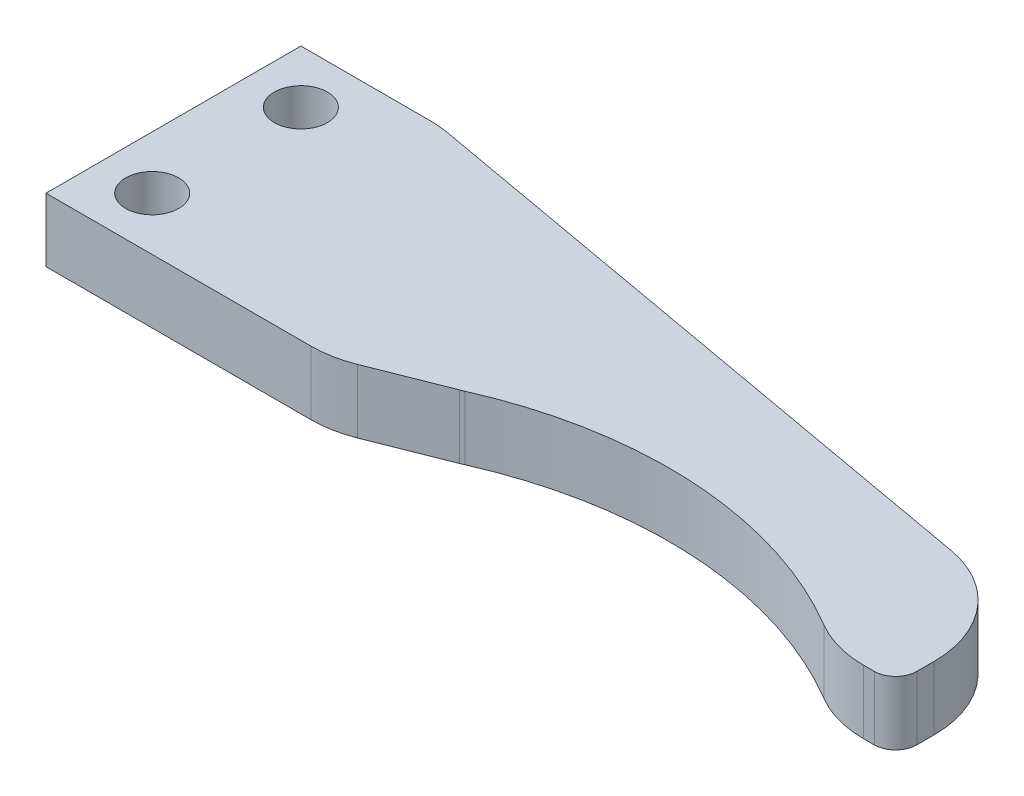
ISO-10303-21;
HEADER;
FILE_DESCRIPTION(('STEP AP214'),'2;1');
FILE_NAME('part.step','',(''),(''),'','','');
FILE_SCHEMA(('AUTOMOTIVE_DESIGN { 1 0 10303 214 1 1 1 1 }'));
ENDSEC;
DATA;
#1=APPLICATION_CONTEXT('core data for automotive mechanical design processes');
#2=APPLICATION_PROTOCOL_DEFINITION('international standard','automotive_design',2000,#1);
#3=PRODUCT_CONTEXT('',#1,'mechanical');
#4=PRODUCT('Part','Part','',(#3));
#5=PRODUCT_RELATED_PRODUCT_CATEGORY('part','',(#4));
#6=PRODUCT_DEFINITION_FORMATION('','',#4);
#7=PRODUCT_DEFINITION_CONTEXT('part definition',#1,'design');
#8=PRODUCT_DEFINITION('design','',#6,#7);
#9=PRODUCT_DEFINITION_SHAPE('','',#8);
#10=(LENGTH_UNIT() NAMED_UNIT(*) SI_UNIT(.MILLI.,.METRE.));
#11=(NAMED_UNIT(*) PLANE_ANGLE_UNIT() SI_UNIT($,.RADIAN.));
#12=(NAMED_UNIT(*) SI_UNIT($,.STERADIAN.) SOLID_ANGLE_UNIT());
#13=UNCERTAINTY_MEASURE_WITH_UNIT(LENGTH_MEASURE(1.E-05),#10,'distance_accuracy_value','');
#14=(GEOMETRIC_REPRESENTATION_CONTEXT(3) GLOBAL_UNCERTAINTY_ASSIGNED_CONTEXT((#13)) GLOBAL_UNIT_ASSIGNED_CONTEXT((#10,
#11,#12)) REPRESENTATION_CONTEXT('',''));
#15=CARTESIAN_POINT('',(0.,0.,0.));
#16=DIRECTION('',(0.,0.,1.));
#17=DIRECTION('',(1.,0.,0.));
#18=AXIS2_PLACEMENT_3D('',#15,#16,#17);
#19=CARTESIAN_POINT('',(20.,3.,6.));
#20=DIRECTION('',(0.,0.,-1.));
#21=DIRECTION('',(-1.,0.,0.));
#22=AXIS2_PLACEMENT_3D('',#19,#20,#21);
#23=PLANE('',#22);
#24=DIRECTION('',(1.,0.,0.));
#25=VECTOR('',#24,1.);
#26=CARTESIAN_POINT('',(20.,0.,6.));
#27=LINE('',#26,#25);
#28=CARTESIAN_POINT('',(-20.,0.,6.));
#29=VERTEX_POINT('',#28);
#30=CARTESIAN_POINT('',(-7.52237429429244,0.,6.));
#31=VERTEX_POINT('',#30);
#32=EDGE_CURVE('E296',#29,#31,#27,.T.);
#33=ORIENTED_EDGE('',*,*,#32,.T.);
#34=DIRECTION('',(0.,1.,0.));
#35=VECTOR('',#34,1.);
#36=CARTESIAN_POINT('',(-7.52237429429244,3.,6.));
#37=LINE('',#36,#35);
#38=CARTESIAN_POINT('',(-7.52237429429244,3.,6.));
#39=VERTEX_POINT('',#38);
#40=EDGE_CURVE('E147',#31,#39,#37,.T.);
#41=ORIENTED_EDGE('',*,*,#40,.T.);
#42=DIRECTION('',(1.,0.,0.));
#43=VECTOR('',#42,1.);
#44=CARTESIAN_POINT('',(20.,3.,6.));
#45=LINE('',#44,#43);
#46=CARTESIAN_POINT('',(-20.,3.,6.));
#47=VERTEX_POINT('',#46);
#48=EDGE_CURVE('E140',#47,#39,#45,.T.);
#49=ORIENTED_EDGE('',*,*,#48,.F.);
#50=DIRECTION('',(0.,-1.,0.));
#51=VECTOR('',#50,1.);
#52=CARTESIAN_POINT('',(-20.,3.,6.));
#53=LINE('',#52,#51);
#54=EDGE_CURVE('E144',#47,#29,#53,.T.);
#55=ORIENTED_EDGE('',*,*,#54,.T.);
#56=EDGE_LOOP('',(#33,#41,#49,#55));
#57=FACE_BOUND('',#56,.T.);
#58=ADVANCED_FACE('F39',(#57),#23,.F.);
#59=CARTESIAN_POINT('',(-20.,3.,6.));
#60=DIRECTION('',(1.,0.,0.));
#61=DIRECTION('',(0.,0.,-1.));
#62=AXIS2_PLACEMENT_3D('',#59,#60,#61);
#63=PLANE('',#62);
#64=DIRECTION('',(0.,0.,1.));
#65=VECTOR('',#64,1.);
#66=CARTESIAN_POINT('',(-20.,0.,6.));
#67=LINE('',#66,#65);
#68=CARTESIAN_POINT('',(-20.,0.,-6.));
#69=VERTEX_POINT('',#68);
#70=EDGE_CURVE('E165',#69,#29,#67,.T.);
#71=ORIENTED_EDGE('',*,*,#70,.T.);
#72=ORIENTED_EDGE('',*,*,#54,.F.);
#73=DIRECTION('',(0.,0.,1.));
#74=VECTOR('',#73,1.);
#75=CARTESIAN_POINT('',(-20.,3.,6.));
#76=LINE('',#75,#74);
#77=CARTESIAN_POINT('',(-20.,3.,-6.));
#78=VERTEX_POINT('',#77);
#79=EDGE_CURVE('E153',#78,#47,#76,.T.);
#80=ORIENTED_EDGE('',*,*,#79,.F.);
#81=DIRECTION('',(0.,-1.,0.));
#82=VECTOR('',#81,1.);
#83=CARTESIAN_POINT('',(-20.,3.,-6.));
#84=LINE('',#83,#82);
#85=EDGE_CURVE('E168',#78,#69,#84,.T.);
#86=ORIENTED_EDGE('',*,*,#85,.T.);
#87=EDGE_LOOP('',(#71,#72,#80,#86));
#88=FACE_BOUND('',#87,.T.);
#89=ADVANCED_FACE('F163',(#88),#63,.F.);
#90=CARTESIAN_POINT('',(18.4884245882385,0.,6.));
#91=VERTEX_POINT('',#90);
#92=CARTESIAN_POINT('',(19.,0.,6.));
#93=VERTEX_POINT('',#92);
#94=EDGE_CURVE('E295',#91,#93,#27,.T.);
#95=ORIENTED_EDGE('',*,*,#94,.T.);
#96=DIRECTION('',(0.,-1.,0.));
#97=VECTOR('',#96,1.);
#98=CARTESIAN_POINT('',(19.,3.,6.));
#99=LINE('',#98,#97);
#100=CARTESIAN_POINT('',(19.,3.,6.));
#101=VERTEX_POINT('',#100);
#102=EDGE_CURVE('E228',#93,#101,#99,.F.);
#103=ORIENTED_EDGE('',*,*,#102,.T.);
#104=CARTESIAN_POINT('',(18.4884245882385,3.,6.));
#105=VERTEX_POINT('',#104);
#106=EDGE_CURVE('E150',#105,#101,#45,.T.);
#107=ORIENTED_EDGE('',*,*,#106,.F.);
#108=DIRECTION('',(0.,1.,0.));
#109=VECTOR('',#108,1.);
#110=CARTESIAN_POINT('',(18.4884245882385,3.,6.));
#111=LINE('',#110,#109);
#112=EDGE_CURVE('E200',#105,#91,#111,.F.);
#113=ORIENTED_EDGE('',*,*,#112,.T.);
#114=EDGE_LOOP('',(#95,#103,#107,#113));
#115=FACE_BOUND('',#114,.T.);
#116=ADVANCED_FACE('F335',(#115),#23,.F.);
#117=CARTESIAN_POINT('',(20.,3.,6.));
#118=DIRECTION('',(-1.,0.,0.));
#119=DIRECTION('',(0.,0.,1.));
#120=AXIS2_PLACEMENT_3D('',#117,#118,#119);
#121=PLANE('',#120);
#122=DIRECTION('',(0.,0.,-1.));
#123=VECTOR('',#122,1.);
#124=CARTESIAN_POINT('',(20.,0.,6.));
#125=LINE('',#124,#123);
#126=CARTESIAN_POINT('',(20.,0.,5.));
#127=VERTEX_POINT('',#126);
#128=CARTESIAN_POINT('',(20.,0.,4.18311968424424));
#129=VERTEX_POINT('',#128);
#130=EDGE_CURVE('E299',#127,#129,#125,.T.);
#131=ORIENTED_EDGE('',*,*,#130,.T.);
#132=DIRECTION('',(0.,1.,0.));
#133=VECTOR('',#132,1.);
#134=CARTESIAN_POINT('',(20.,3.,4.18311968424424));
#135=LINE('',#134,#133);
#136=CARTESIAN_POINT('',(20.,3.,4.18311968424424));
#137=VERTEX_POINT('',#136);
#138=EDGE_CURVE('E234',#129,#137,#135,.T.);
#139=ORIENTED_EDGE('',*,*,#138,.T.);
#140=DIRECTION('',(0.,0.,-1.));
#141=VECTOR('',#140,1.);
#142=CARTESIAN_POINT('',(20.,3.,6.));
#143=LINE('',#142,#141);
#144=CARTESIAN_POINT('',(20.,3.,5.));
#145=VERTEX_POINT('',#144);
#146=EDGE_CURVE('E149',#145,#137,#143,.T.);
#147=ORIENTED_EDGE('',*,*,#146,.F.);
#148=DIRECTION('',(0.,-1.,0.));
#149=VECTOR('',#148,1.);
#150=CARTESIAN_POINT('',(20.,3.,5.));
#151=LINE('',#150,#149);
#152=EDGE_CURVE('E221',#145,#127,#151,.T.);
#153=ORIENTED_EDGE('',*,*,#152,.T.);
#154=EDGE_LOOP('',(#131,#139,#147,#153));
#155=FACE_BOUND('',#154,.T.);
#156=ADVANCED_FACE('F344',(#155),#121,.F.);
#157=CARTESIAN_POINT('',(20.,3.,-6.));
#158=DIRECTION('',(0.,0.,1.));
#159=DIRECTION('',(1.,0.,0.));
#160=AXIS2_PLACEMENT_3D('',#157,#158,#159);
#161=PLANE('',#160);
#162=DIRECTION('',(-1.,0.,0.));
#163=VECTOR('',#162,1.);
#164=CARTESIAN_POINT('',(20.,3.,-6.));
#165=LINE('',#164,#163);
#166=CARTESIAN_POINT('',(-13.9029952942542,3.,-6.));
#167=VERTEX_POINT('',#166);
#168=EDGE_CURVE('E156',#167,#78,#165,.T.);
#169=ORIENTED_EDGE('',*,*,#168,.F.);
#170=DIRECTION('',(0.,1.,0.));
#171=VECTOR('',#170,1.);
#172=CARTESIAN_POINT('',(-13.9029952942542,3.,-6.));
#173=LINE('',#172,#171);
#174=CARTESIAN_POINT('',(-13.9029952942542,0.,-6.));
#175=VERTEX_POINT('',#174);
#176=EDGE_CURVE('E48',#167,#175,#173,.F.);
#177=ORIENTED_EDGE('',*,*,#176,.T.);
#178=DIRECTION('',(-1.,0.,0.));
#179=VECTOR('',#178,1.);
#180=CARTESIAN_POINT('',(20.,0.,-6.));
#181=LINE('',#180,#179);
#182=EDGE_CURVE('E161',#175,#69,#181,.T.);
#183=ORIENTED_EDGE('',*,*,#182,.T.);
#184=ORIENTED_EDGE('',*,*,#85,.F.);
#185=EDGE_LOOP('',(#169,#177,#183,#184));
#186=FACE_BOUND('',#185,.T.);
#187=ADVANCED_FACE('F303',(#186),#161,.F.);
#188=CARTESIAN_POINT('',(0.,3.,0.));
#189=DIRECTION('',(0.,1.,0.));
#190=DIRECTION('',(0.,0.,1.));
#191=AXIS2_PLACEMENT_3D('',#188,#189,#190);
#192=PLANE('',#191);
#193=DIRECTION('',(0.98429841988096,0.,0.176512380925091));
#194=VECTOR('',#193,1.);
#195=CARTESIAN_POINT('',(-13.4582225243004,3.,-6.));
#196=LINE('',#195,#194);
#197=CARTESIAN_POINT('',(-13.0204333896288,3.,-5.9214920994048));
#198=VERTEX_POINT('',#197);
#199=CARTESIAN_POINT('',(15.8825619046255,3.,-0.738372415160565));
#200=VERTEX_POINT('',#199);
#201=EDGE_CURVE('E259',#198,#200,#196,.T.);
#202=ORIENTED_EDGE('',*,*,#201,.F.);
#203=CARTESIAN_POINT('',(-13.9029952942542,3.,-0.999999999999998));
#204=DIRECTION('',(0.,1.,0.));
#205=DIRECTION('',(0.,0.,1.));
#206=AXIS2_PLACEMENT_3D('',#203,#204,#205);
#207=CIRCLE('',#206,5.);
#208=EDGE_CURVE('E62',#198,#167,#207,.T.);
#209=ORIENTED_EDGE('',*,*,#208,.T.);
#210=ORIENTED_EDGE('',*,*,#168,.T.);
#211=ORIENTED_EDGE('',*,*,#79,.T.);
#212=ORIENTED_EDGE('',*,*,#48,.T.);
#213=CARTESIAN_POINT('',(-7.52237429429244,3.,1.));
#214=DIRECTION('',(0.,1.,0.));
#215=DIRECTION('',(0.,0.,1.));
#216=AXIS2_PLACEMENT_3D('',#213,#214,#215);
#217=CIRCLE('',#216,5.);
#218=CARTESIAN_POINT('',(-5.68369022645478,3.,5.64964954579159));
#219=VERTEX_POINT('',#218);
#220=EDGE_CURVE('E191',#39,#219,#217,.T.);
#221=ORIENTED_EDGE('',*,*,#220,.T.);
#222=DIRECTION('',(-0.929929909158319,0.,0.367736813567531));
#223=VECTOR('',#222,1.);
#224=CARTESIAN_POINT('',(-2.14460861528366,3.,4.25013482771412));
#225=LINE('',#224,#223);
#226=CARTESIAN_POINT('',(-2.24111539637451,3.,4.28829802239847));
#227=VERTEX_POINT('',#226);
#228=EDGE_CURVE('E266',#227,#219,#225,.T.);
#229=ORIENTED_EDGE('',*,*,#228,.F.);
#230=CARTESIAN_POINT('',(-4.07979946421216,3.,-0.361351523393123));
#231=DIRECTION('',(0.,1.,0.));
#232=DIRECTION('',(0.,0.,1.));
#233=AXIS2_PLACEMENT_3D('',#230,#231,#232);
#234=CIRCLE('',#233,5.);
#235=CARTESIAN_POINT('',(-2.05993004498401,3.,4.21250106816106));
#236=VERTEX_POINT('',#235);
#237=EDGE_CURVE('E194',#227,#236,#234,.T.);
#238=ORIENTED_EDGE('',*,*,#237,.T.);
#239=CARTESIAN_POINT('',(5.88433111463469,3.,22.2017231173716));
#240=DIRECTION('',(0.,1.,0.));
#241=DIRECTION('',(0.,0.,1.));
#242=AXIS2_PLACEMENT_3D('',#239,#240,#241);
#243=CIRCLE('',#242,19.6652840129002);
#244=CARTESIAN_POINT('',(15.9333975577345,3.,5.29788748961554));
#245=VERTEX_POINT('',#244);
#246=EDGE_CURVE('E274',#245,#236,#243,.T.);
#247=ORIENTED_EDGE('',*,*,#246,.F.);
#248=CARTESIAN_POINT('',(18.4884245882385,3.,0.999999999999999));
#249=DIRECTION('',(0.,1.,0.));
#250=DIRECTION('',(0.,0.,1.));
#251=AXIS2_PLACEMENT_3D('',#248,#249,#250);
#252=CIRCLE('',#251,5.);
#253=EDGE_CURVE('E197',#245,#105,#252,.T.);
#254=ORIENTED_EDGE('',*,*,#253,.T.);
#255=ORIENTED_EDGE('',*,*,#106,.T.);
#256=CARTESIAN_POINT('',(19.,3.,5.));
#257=DIRECTION('',(0.,1.,0.));
#258=DIRECTION('',(0.,0.,1.));
#259=AXIS2_PLACEMENT_3D('',#256,#257,#258);
#260=CIRCLE('',#259,1.);
#261=EDGE_CURVE('E231',#101,#145,#260,.T.);
#262=ORIENTED_EDGE('',*,*,#261,.T.);
#263=ORIENTED_EDGE('',*,*,#146,.T.);
#264=CARTESIAN_POINT('',(15.,3.,4.18311968424424));
#265=DIRECTION('',(0.,1.,0.));
#266=DIRECTION('',(0.,0.,1.));
#267=AXIS2_PLACEMENT_3D('',#264,#265,#266);
#268=CIRCLE('',#267,5.);
#269=EDGE_CURVE('E238',#137,#200,#268,.T.);
#270=ORIENTED_EDGE('',*,*,#269,.T.);
#271=EDGE_LOOP('',(#202,#209,#210,#211,#212,#221,#229,#238,#247,#254,#255,#262,#263,#270));
#272=FACE_BOUND('',#271,.T.);
#273=CARTESIAN_POINT('',(-17.5,3.,3.5));
#274=DIRECTION('',(0.,1.,0.));
#275=DIRECTION('',(0.,0.,1.));
#276=AXIS2_PLACEMENT_3D('',#273,#274,#275);
#277=CIRCLE('',#276,1.25);
#278=CARTESIAN_POINT('',(-17.5,3.,4.75));
#279=VERTEX_POINT('',#278);
#280=EDGE_CURVE('E265',#279,#279,#277,.T.);
#281=ORIENTED_EDGE('',*,*,#280,.F.);
#282=EDGE_LOOP('',(#281));
#283=FACE_BOUND('',#282,.T.);
#284=CARTESIAN_POINT('',(-17.5,3.,-3.5));
#285=DIRECTION('',(0.,1.,0.));
#286=DIRECTION('',(0.,0.,1.));
#287=AXIS2_PLACEMENT_3D('',#284,#285,#286);
#288=CIRCLE('',#287,1.25);
#289=CARTESIAN_POINT('',(-17.5,3.,-2.25));
#290=VERTEX_POINT('',#289);
#291=EDGE_CURVE('E280',#290,#290,#288,.T.);
#292=ORIENTED_EDGE('',*,*,#291,.F.);
#293=EDGE_LOOP('',(#292));
#294=FACE_BOUND('',#293,.T.);
#295=ADVANCED_FACE('F154',(#272,#283,#294),#192,.T.);
#296=CARTESIAN_POINT('',(0.,0.,0.));
#297=DIRECTION('',(0.,1.,0.));
#298=DIRECTION('',(0.,0.,1.));
#299=AXIS2_PLACEMENT_3D('',#296,#297,#298);
#300=PLANE('',#299);
#301=CARTESIAN_POINT('',(-17.5,0.,3.5));
#302=DIRECTION('',(0.,1.,0.));
#303=DIRECTION('',(0.,0.,1.));
#304=AXIS2_PLACEMENT_3D('',#301,#302,#303);
#305=CIRCLE('',#304,1.25);
#306=CARTESIAN_POINT('',(-17.5,0.,4.75));
#307=VERTEX_POINT('',#306);
#308=EDGE_CURVE('E271',#307,#307,#305,.T.);
#309=ORIENTED_EDGE('',*,*,#308,.T.);
#310=EDGE_LOOP('',(#309));
#311=FACE_BOUND('',#310,.T.);
#312=CARTESIAN_POINT('',(-17.5,0.,-3.5));
#313=DIRECTION('',(0.,1.,0.));
#314=DIRECTION('',(0.,0.,1.));
#315=AXIS2_PLACEMENT_3D('',#312,#313,#314);
#316=CIRCLE('',#315,1.25);
#317=CARTESIAN_POINT('',(-17.5,0.,-2.25));
#318=VERTEX_POINT('',#317);
#319=EDGE_CURVE('E282',#318,#318,#316,.T.);
#320=ORIENTED_EDGE('',*,*,#319,.T.);
#321=EDGE_LOOP('',(#320));
#322=FACE_BOUND('',#321,.T.);
#323=ORIENTED_EDGE('',*,*,#182,.F.);
#324=CARTESIAN_POINT('',(-13.9029952942542,0.,-0.999999999999998));
#325=DIRECTION('',(0.,1.,0.));
#326=DIRECTION('',(0.,0.,1.));
#327=AXIS2_PLACEMENT_3D('',#324,#325,#326);
#328=CIRCLE('',#327,5.);
#329=CARTESIAN_POINT('',(-13.0204333896288,0.,-5.9214920994048));
#330=VERTEX_POINT('',#329);
#331=EDGE_CURVE('E11',#175,#330,#328,.F.);
#332=ORIENTED_EDGE('',*,*,#331,.T.);
#333=DIRECTION('',(0.984298419880961,0.,0.176512380925091));
#334=VECTOR('',#333,1.);
#335=CARTESIAN_POINT('',(0.623132412396887,0.,-3.47481715267986));
#336=LINE('',#335,#334);
#337=CARTESIAN_POINT('',(15.8825619046255,0.,-0.738372415160564));
#338=VERTEX_POINT('',#337);
#339=EDGE_CURVE('E181',#330,#338,#336,.T.);
#340=ORIENTED_EDGE('',*,*,#339,.T.);
#341=CARTESIAN_POINT('',(15.,0.,4.18311968424424));
#342=DIRECTION('',(0.,1.,0.));
#343=DIRECTION('',(0.,0.,1.));
#344=AXIS2_PLACEMENT_3D('',#341,#342,#343);
#345=CIRCLE('',#344,5.);
#346=EDGE_CURVE('E246',#338,#129,#345,.F.);
#347=ORIENTED_EDGE('',*,*,#346,.T.);
#348=ORIENTED_EDGE('',*,*,#130,.F.);
#349=CARTESIAN_POINT('',(19.,0.,5.));
#350=DIRECTION('',(0.,1.,0.));
#351=DIRECTION('',(0.,0.,1.));
#352=AXIS2_PLACEMENT_3D('',#349,#350,#351);
#353=CIRCLE('',#352,1.);
#354=EDGE_CURVE('E225',#127,#93,#353,.F.);
#355=ORIENTED_EDGE('',*,*,#354,.T.);
#356=ORIENTED_EDGE('',*,*,#94,.F.);
#357=CARTESIAN_POINT('',(18.4884245882385,0.,0.999999999999999));
#358=DIRECTION('',(0.,1.,0.));
#359=DIRECTION('',(0.,0.,1.));
#360=AXIS2_PLACEMENT_3D('',#357,#358,#359);
#361=CIRCLE('',#360,5.);
#362=CARTESIAN_POINT('',(15.9333975577345,0.,5.29788748961554));
#363=VERTEX_POINT('',#362);
#364=EDGE_CURVE('E209',#91,#363,#361,.F.);
#365=ORIENTED_EDGE('',*,*,#364,.T.);
#366=CARTESIAN_POINT('',(5.88433111463469,0.,22.2017231173716));
#367=DIRECTION('',(0.,1.,0.));
#368=DIRECTION('',(0.,0.,1.));
#369=AXIS2_PLACEMENT_3D('',#366,#367,#368);
#370=CIRCLE('',#369,19.6652840129002);
#371=CARTESIAN_POINT('',(-2.05993004498401,0.,4.21250106816106));
#372=VERTEX_POINT('',#371);
#373=EDGE_CURVE('E167',#363,#372,#370,.T.);
#374=ORIENTED_EDGE('',*,*,#373,.T.);
#375=CARTESIAN_POINT('',(-4.07979946421216,0.,-0.361351523393123));
#376=DIRECTION('',(0.,1.,0.));
#377=DIRECTION('',(0.,0.,1.));
#378=AXIS2_PLACEMENT_3D('',#375,#376,#377);
#379=CIRCLE('',#378,5.);
#380=CARTESIAN_POINT('',(-2.24111539637451,0.,4.28829802239847));
#381=VERTEX_POINT('',#380);
#382=EDGE_CURVE('E206',#372,#381,#379,.F.);
#383=ORIENTED_EDGE('',*,*,#382,.T.);
#384=DIRECTION('',(-0.929929909158319,0.,0.367736813567531));
#385=VECTOR('',#384,1.);
#386=CARTESIAN_POINT('',(1.16340011511408,0.,2.94199689410247));
#387=LINE('',#386,#385);
#388=CARTESIAN_POINT('',(-5.68369022645478,0.,5.6496495457916));
#389=VERTEX_POINT('',#388);
#390=EDGE_CURVE('E173',#381,#389,#387,.T.);
#391=ORIENTED_EDGE('',*,*,#390,.T.);
#392=CARTESIAN_POINT('',(-7.52237429429244,0.,1.));
#393=DIRECTION('',(0.,1.,0.));
#394=DIRECTION('',(0.,0.,1.));
#395=AXIS2_PLACEMENT_3D('',#392,#393,#394);
#396=CIRCLE('',#395,5.);
#397=EDGE_CURVE('E203',#389,#31,#396,.F.);
#398=ORIENTED_EDGE('',*,*,#397,.T.);
#399=ORIENTED_EDGE('',*,*,#32,.F.);
#400=ORIENTED_EDGE('',*,*,#70,.F.);
#401=EDGE_LOOP('',(#323,#332,#340,#347,#348,#355,#356,#365,#374,#383,#391,#398,#399,#400));
#402=FACE_BOUND('',#401,.T.);
#403=ADVANCED_FACE('F305',(#311,#322,#402),#300,.F.);
#404=CARTESIAN_POINT('',(-17.5,0.,-3.5));
#405=DIRECTION('',(0.,1.,0.));
#406=DIRECTION('',(0.,0.,1.));
#407=AXIS2_PLACEMENT_3D('',#404,#405,#406);
#408=CYLINDRICAL_SURFACE('',#407,1.25);
#409=ORIENTED_EDGE('',*,*,#319,.F.);
#410=EDGE_LOOP('',(#409));
#411=FACE_BOUND('',#410,.T.);
#412=ORIENTED_EDGE('',*,*,#291,.T.);
#413=EDGE_LOOP('',(#412));
#414=FACE_BOUND('',#413,.T.);
#415=ADVANCED_FACE('F372',(#411,#414),#408,.F.);
#416=CARTESIAN_POINT('',(-17.5,0.,3.5));
#417=DIRECTION('',(0.,1.,0.));
#418=DIRECTION('',(0.,0.,1.));
#419=AXIS2_PLACEMENT_3D('',#416,#417,#418);
#420=CYLINDRICAL_SURFACE('',#419,1.25);
#421=ORIENTED_EDGE('',*,*,#308,.F.);
#422=EDGE_LOOP('',(#421));
#423=FACE_BOUND('',#422,.T.);
#424=ORIENTED_EDGE('',*,*,#280,.T.);
#425=EDGE_LOOP('',(#424));
#426=FACE_BOUND('',#425,.T.);
#427=ADVANCED_FACE('F378',(#423,#426),#420,.F.);
#428=CARTESIAN_POINT('',(5.88433111463469,-7.,22.2017231173716));
#429=DIRECTION('',(0.,1.,0.));
#430=DIRECTION('',(0.,0.,1.));
#431=AXIS2_PLACEMENT_3D('',#428,#429,#430);
#432=CYLINDRICAL_SURFACE('',#431,19.6652840129002);
#433=ORIENTED_EDGE('',*,*,#373,.F.);
#434=DIRECTION('',(0.,1.,0.));
#435=VECTOR('',#434,1.);
#436=CARTESIAN_POINT('',(15.9333975577345,-7.,5.29788748961554));
#437=LINE('',#436,#435);
#438=EDGE_CURVE('E187',#363,#245,#437,.T.);
#439=ORIENTED_EDGE('',*,*,#438,.T.);
#440=ORIENTED_EDGE('',*,*,#246,.T.);
#441=DIRECTION('',(0.,1.,0.));
#442=VECTOR('',#441,1.);
#443=CARTESIAN_POINT('',(-2.05993004498401,-7.,4.21250106816106));
#444=LINE('',#443,#442);
#445=EDGE_CURVE('E184',#236,#372,#444,.F.);
#446=ORIENTED_EDGE('',*,*,#445,.T.);
#447=EDGE_LOOP('',(#433,#439,#440,#446));
#448=FACE_BOUND('',#447,.T.);
#449=ADVANCED_FACE('F323',(#448),#432,.F.);
#450=CARTESIAN_POINT('',(-2.14460861528366,-7.,4.25013482771412));
#451=DIRECTION('',(-0.367736813567531,0.,-0.929929909158319));
#452=DIRECTION('',(-0.929929909158319,0.,0.367736813567531));
#453=AXIS2_PLACEMENT_3D('',#450,#451,#452);
#454=PLANE('',#453);
#455=ORIENTED_EDGE('',*,*,#390,.F.);
#456=DIRECTION('',(0.,1.,0.));
#457=VECTOR('',#456,1.);
#458=CARTESIAN_POINT('',(-2.24111539637451,-7.,4.28829802239847));
#459=LINE('',#458,#457);
#460=EDGE_CURVE('E215',#381,#227,#459,.T.);
#461=ORIENTED_EDGE('',*,*,#460,.T.);
#462=ORIENTED_EDGE('',*,*,#228,.T.);
#463=DIRECTION('',(0.,1.,0.));
#464=VECTOR('',#463,1.);
#465=CARTESIAN_POINT('',(-5.68369022645478,-7.,5.64964954579159));
#466=LINE('',#465,#464);
#467=EDGE_CURVE('E212',#219,#389,#466,.F.);
#468=ORIENTED_EDGE('',*,*,#467,.T.);
#469=EDGE_LOOP('',(#455,#461,#462,#468));
#470=FACE_BOUND('',#469,.T.);
#471=ADVANCED_FACE('F313',(#470),#454,.F.);
#472=CARTESIAN_POINT('',(-13.4582225243004,-7.,-6.));
#473=DIRECTION('',(-0.176512380925091,0.,0.98429841988096));
#474=DIRECTION('',(0.984298419880961,0.,0.176512380925091));
#475=AXIS2_PLACEMENT_3D('',#472,#473,#474);
#476=PLANE('',#475);
#477=ORIENTED_EDGE('',*,*,#339,.F.);
#478=DIRECTION('',(0.,1.,0.));
#479=VECTOR('',#478,1.);
#480=CARTESIAN_POINT('',(-13.0204333896288,-7.,-5.9214920994048));
#481=LINE('',#480,#479);
#482=EDGE_CURVE('E249',#330,#198,#481,.T.);
#483=ORIENTED_EDGE('',*,*,#482,.T.);
#484=ORIENTED_EDGE('',*,*,#201,.T.);
#485=DIRECTION('',(0.,1.,0.));
#486=VECTOR('',#485,1.);
#487=CARTESIAN_POINT('',(15.8825619046255,-7.,-0.738372415160563));
#488=LINE('',#487,#486);
#489=EDGE_CURVE('E242',#200,#338,#488,.F.);
#490=ORIENTED_EDGE('',*,*,#489,.T.);
#491=EDGE_LOOP('',(#477,#483,#484,#490));
#492=FACE_BOUND('',#491,.T.);
#493=ADVANCED_FACE('F258',(#492),#476,.F.);
#494=CARTESIAN_POINT('',(18.4884245882385,-7.,0.999999999999999));
#495=DIRECTION('',(0.,1.,0.));
#496=DIRECTION('',(0.,0.,1.));
#497=AXIS2_PLACEMENT_3D('',#494,#495,#496);
#498=CYLINDRICAL_SURFACE('',#497,5.);
#499=ORIENTED_EDGE('',*,*,#364,.F.);
#500=ORIENTED_EDGE('',*,*,#112,.F.);
#501=ORIENTED_EDGE('',*,*,#253,.F.);
#502=ORIENTED_EDGE('',*,*,#438,.F.);
#503=EDGE_LOOP('',(#499,#500,#501,#502));
#504=FACE_BOUND('',#503,.T.);
#505=ADVANCED_FACE('F328',(#504),#498,.T.);
#506=CARTESIAN_POINT('',(-4.07979946421216,-7.,-0.361351523393123));
#507=DIRECTION('',(0.,1.,0.));
#508=DIRECTION('',(0.,0.,1.));
#509=AXIS2_PLACEMENT_3D('',#506,#507,#508);
#510=CYLINDRICAL_SURFACE('',#509,5.);
#511=ORIENTED_EDGE('',*,*,#382,.F.);
#512=ORIENTED_EDGE('',*,*,#445,.F.);
#513=ORIENTED_EDGE('',*,*,#237,.F.);
#514=ORIENTED_EDGE('',*,*,#460,.F.);
#515=EDGE_LOOP('',(#511,#512,#513,#514));
#516=FACE_BOUND('',#515,.T.);
#517=ADVANCED_FACE('F317',(#516),#510,.T.);
#518=CARTESIAN_POINT('',(-7.52237429429244,3.,1.));
#519=DIRECTION('',(0.,1.,0.));
#520=DIRECTION('',(0.,0.,1.));
#521=AXIS2_PLACEMENT_3D('',#518,#519,#520);
#522=CYLINDRICAL_SURFACE('',#521,5.);
#523=ORIENTED_EDGE('',*,*,#397,.F.);
#524=ORIENTED_EDGE('',*,*,#467,.F.);
#525=ORIENTED_EDGE('',*,*,#220,.F.);
#526=ORIENTED_EDGE('',*,*,#40,.F.);
#527=EDGE_LOOP('',(#523,#524,#525,#526));
#528=FACE_BOUND('',#527,.T.);
#529=ADVANCED_FACE('F308',(#528),#522,.T.);
#530=CARTESIAN_POINT('',(19.,3.,5.));
#531=DIRECTION('',(0.,-1.,0.));
#532=DIRECTION('',(0.,0.,-1.));
#533=AXIS2_PLACEMENT_3D('',#530,#531,#532);
#534=CYLINDRICAL_SURFACE('',#533,1.);
#535=ORIENTED_EDGE('',*,*,#261,.F.);
#536=ORIENTED_EDGE('',*,*,#102,.F.);
#537=ORIENTED_EDGE('',*,*,#354,.F.);
#538=ORIENTED_EDGE('',*,*,#152,.F.);
#539=EDGE_LOOP('',(#535,#536,#537,#538));
#540=FACE_BOUND('',#539,.T.);
#541=ADVANCED_FACE('F340',(#540),#534,.T.);
#542=CARTESIAN_POINT('',(15.,3.,4.18311968424424));
#543=DIRECTION('',(0.,1.,0.));
#544=DIRECTION('',(0.,0.,1.));
#545=AXIS2_PLACEMENT_3D('',#542,#543,#544);
#546=CYLINDRICAL_SURFACE('',#545,5.);
#547=ORIENTED_EDGE('',*,*,#346,.F.);
#548=ORIENTED_EDGE('',*,*,#489,.F.);
#549=ORIENTED_EDGE('',*,*,#269,.F.);
#550=ORIENTED_EDGE('',*,*,#138,.F.);
#551=EDGE_LOOP('',(#547,#548,#549,#550));
#552=FACE_BOUND('',#551,.T.);
#553=ADVANCED_FACE('F349',(#552),#546,.T.);
#554=CARTESIAN_POINT('',(-13.9029952942542,-7.,-0.999999999999998));
#555=DIRECTION('',(0.,1.,0.));
#556=DIRECTION('',(0.,0.,1.));
#557=AXIS2_PLACEMENT_3D('',#554,#555,#556);
#558=CYLINDRICAL_SURFACE('',#557,5.);
#559=ORIENTED_EDGE('',*,*,#331,.F.);
#560=ORIENTED_EDGE('',*,*,#176,.F.);
#561=ORIENTED_EDGE('',*,*,#208,.F.);
#562=ORIENTED_EDGE('',*,*,#482,.F.);
#563=EDGE_LOOP('',(#559,#560,#561,#562));
#564=FACE_BOUND('',#563,.T.);
#565=ADVANCED_FACE('F41',(#564),#558,.T.);
#566=CLOSED_SHELL('',(#58,#89,#116,#156,#187,#295,#403,#415,#427,#449,#471,#493,#505,#517,#529,
#541,#553,#565));
#567=MANIFOLD_SOLID_BREP('B2',#566);
#568=ADVANCED_BREP_SHAPE_REPRESENTATION('',(#18,#567),#14);
#569=SHAPE_DEFINITION_REPRESENTATION(#9,#568);
ENDSEC;
END-ISO-10303-21;
